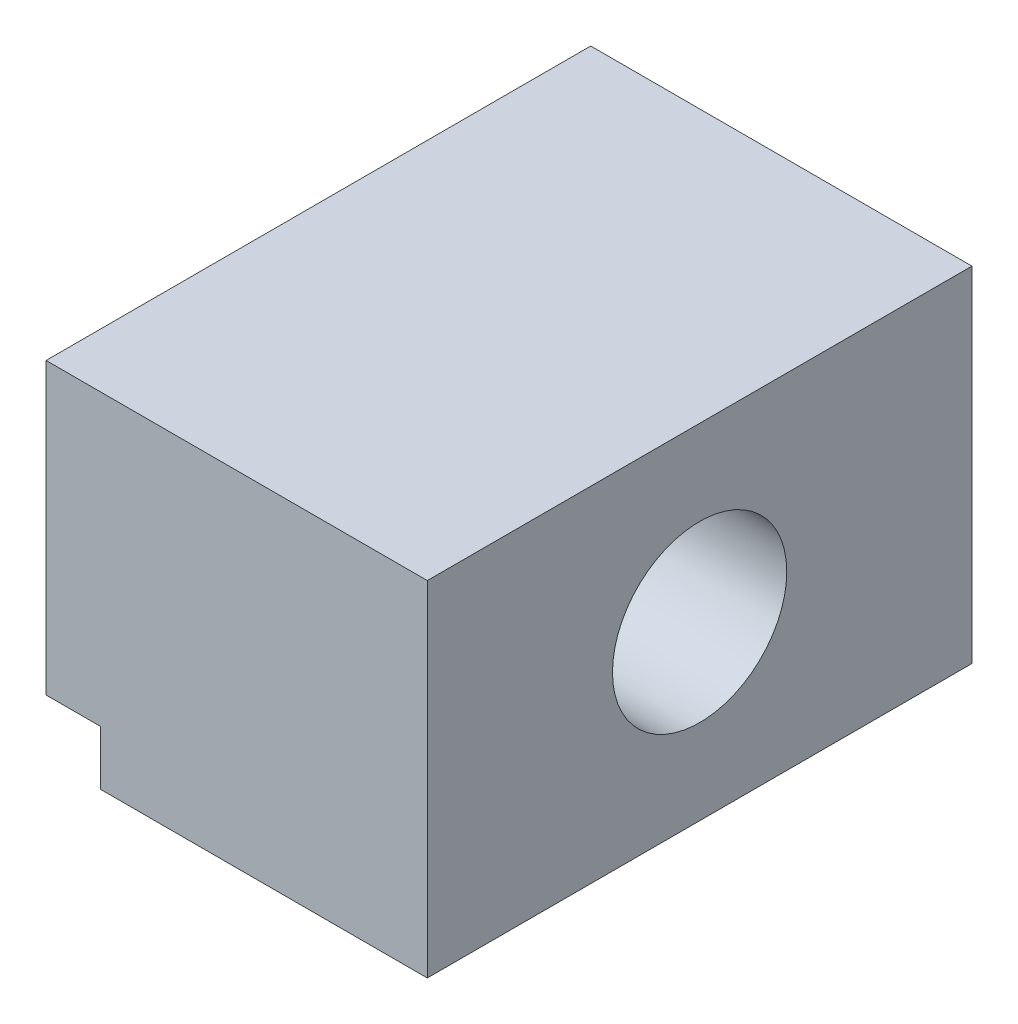
ISO-10303-21;
HEADER;
FILE_DESCRIPTION(('STEP AP214'),'2;1');
FILE_NAME('part.step','',(''),(''),'','','');
FILE_SCHEMA(('AUTOMOTIVE_DESIGN { 1 0 10303 214 1 1 1 1 }'));
ENDSEC;
DATA;
#1=APPLICATION_CONTEXT('core data for automotive mechanical design processes');
#2=APPLICATION_PROTOCOL_DEFINITION('international standard','automotive_design',2000,#1);
#3=PRODUCT_CONTEXT('',#1,'mechanical');
#4=PRODUCT('Part','Part','',(#3));
#5=PRODUCT_RELATED_PRODUCT_CATEGORY('part','',(#4));
#6=PRODUCT_DEFINITION_FORMATION('','',#4);
#7=PRODUCT_DEFINITION_CONTEXT('part definition',#1,'design');
#8=PRODUCT_DEFINITION('design','',#6,#7);
#9=PRODUCT_DEFINITION_SHAPE('','',#8);
#10=(LENGTH_UNIT() NAMED_UNIT(*) SI_UNIT(.MILLI.,.METRE.));
#11=(NAMED_UNIT(*) PLANE_ANGLE_UNIT() SI_UNIT($,.RADIAN.));
#12=(NAMED_UNIT(*) SI_UNIT($,.STERADIAN.) SOLID_ANGLE_UNIT());
#13=UNCERTAINTY_MEASURE_WITH_UNIT(LENGTH_MEASURE(1.E-05),#10,'distance_accuracy_value','');
#14=(GEOMETRIC_REPRESENTATION_CONTEXT(3) GLOBAL_UNCERTAINTY_ASSIGNED_CONTEXT((#13)) GLOBAL_UNIT_ASSIGNED_CONTEXT((#10,
#11,#12)) REPRESENTATION_CONTEXT('',''));
#15=CARTESIAN_POINT('',(0.,0.,0.));
#16=DIRECTION('',(0.,0.,1.));
#17=DIRECTION('',(1.,0.,0.));
#18=AXIS2_PLACEMENT_3D('',#15,#16,#17);
#19=CARTESIAN_POINT('',(-3.,0.5,-2.5));
#20=DIRECTION('',(0.,0.,1.));
#21=DIRECTION('',(1.,0.,0.));
#22=AXIS2_PLACEMENT_3D('',#19,#20,#21);
#23=PLANE('',#22);
#24=DIRECTION('',(-1.,0.,0.));
#25=VECTOR('',#24,1.);
#26=CARTESIAN_POINT('',(-3.5,3.16,-2.5));
#27=LINE('',#26,#25);
#28=CARTESIAN_POINT('',(0.,3.16,-2.5));
#29=VERTEX_POINT('',#28);
#30=CARTESIAN_POINT('',(-3.5,3.16,-2.5));
#31=VERTEX_POINT('',#30);
#32=EDGE_CURVE('E180',#29,#31,#27,.T.);
#33=ORIENTED_EDGE('',*,*,#32,.F.);
#34=DIRECTION('',(0.,1.,0.));
#35=VECTOR('',#34,1.);
#36=CARTESIAN_POINT('',(0.,0.,-2.5));
#37=LINE('',#36,#35);
#38=CARTESIAN_POINT('',(0.,0.,-2.5));
#39=VERTEX_POINT('',#38);
#40=EDGE_CURVE('E58',#39,#29,#37,.T.);
#41=ORIENTED_EDGE('',*,*,#40,.F.);
#42=DIRECTION('',(-1.,0.,0.));
#43=VECTOR('',#42,1.);
#44=CARTESIAN_POINT('',(-3.,0.,-2.5));
#45=LINE('',#44,#43);
#46=CARTESIAN_POINT('',(-3.,0.,-2.5));
#47=VERTEX_POINT('',#46);
#48=EDGE_CURVE('E116',#39,#47,#45,.T.);
#49=ORIENTED_EDGE('',*,*,#48,.T.);
#50=DIRECTION('',(0.,-1.,0.));
#51=VECTOR('',#50,1.);
#52=CARTESIAN_POINT('',(-3.,0.5,-2.5));
#53=LINE('',#52,#51);
#54=CARTESIAN_POINT('',(-3.,0.5,-2.5));
#55=VERTEX_POINT('',#54);
#56=EDGE_CURVE('E136',#55,#47,#53,.T.);
#57=ORIENTED_EDGE('',*,*,#56,.F.);
#58=DIRECTION('',(-1.,0.,0.));
#59=VECTOR('',#58,1.);
#60=CARTESIAN_POINT('',(-3.5,0.5,-2.5));
#61=LINE('',#60,#59);
#62=CARTESIAN_POINT('',(-3.5,0.5,-2.5));
#63=VERTEX_POINT('',#62);
#64=EDGE_CURVE('E199',#55,#63,#61,.T.);
#65=ORIENTED_EDGE('',*,*,#64,.T.);
#66=DIRECTION('',(0.,-1.,0.));
#67=VECTOR('',#66,1.);
#68=CARTESIAN_POINT('',(-3.5,14.9223252670426,-2.5));
#69=LINE('',#68,#67);
#70=EDGE_CURVE('E182',#31,#63,#69,.T.);
#71=ORIENTED_EDGE('',*,*,#70,.F.);
#72=EDGE_LOOP('',(#33,#41,#49,#57,#65,#71));
#73=FACE_BOUND('',#72,.T.);
#74=ADVANCED_FACE('F40',(#73),#23,.F.);
#75=CARTESIAN_POINT('',(-3.,0.5,-2.5));
#76=DIRECTION('',(1.,0.,0.));
#77=DIRECTION('',(0.,0.,-1.));
#78=AXIS2_PLACEMENT_3D('',#75,#76,#77);
#79=PLANE('',#78);
#80=DIRECTION('',(0.,0.,1.));
#81=VECTOR('',#80,1.);
#82=CARTESIAN_POINT('',(-3.,0.,-2.5));
#83=LINE('',#82,#81);
#84=CARTESIAN_POINT('',(-3.,0.,2.5));
#85=VERTEX_POINT('',#84);
#86=EDGE_CURVE('E125',#47,#85,#83,.T.);
#87=ORIENTED_EDGE('',*,*,#86,.T.);
#88=DIRECTION('',(0.,-1.,0.));
#89=VECTOR('',#88,1.);
#90=CARTESIAN_POINT('',(-3.,0.5,2.5));
#91=LINE('',#90,#89);
#92=CARTESIAN_POINT('',(-3.,0.5,2.5));
#93=VERTEX_POINT('',#92);
#94=EDGE_CURVE('E122',#93,#85,#91,.T.);
#95=ORIENTED_EDGE('',*,*,#94,.F.);
#96=DIRECTION('',(0.,0.,1.));
#97=VECTOR('',#96,1.);
#98=CARTESIAN_POINT('',(-3.,0.5,-2.5));
#99=LINE('',#98,#97);
#100=EDGE_CURVE('E124',#55,#93,#99,.T.);
#101=ORIENTED_EDGE('',*,*,#100,.F.);
#102=ORIENTED_EDGE('',*,*,#56,.T.);
#103=EDGE_LOOP('',(#87,#95,#101,#102));
#104=FACE_BOUND('',#103,.T.);
#105=ADVANCED_FACE('F170',(#104),#79,.F.);
#106=CARTESIAN_POINT('',(-3.,0.5,2.5));
#107=DIRECTION('',(0.,0.,-1.));
#108=DIRECTION('',(-1.,0.,0.));
#109=AXIS2_PLACEMENT_3D('',#106,#107,#108);
#110=PLANE('',#109);
#111=DIRECTION('',(1.,0.,0.));
#112=VECTOR('',#111,1.);
#113=CARTESIAN_POINT('',(-3.,0.,2.5));
#114=LINE('',#113,#112);
#115=CARTESIAN_POINT('',(0.,0.,2.5));
#116=VERTEX_POINT('',#115);
#117=EDGE_CURVE('E115',#85,#116,#114,.T.);
#118=ORIENTED_EDGE('',*,*,#117,.T.);
#119=DIRECTION('',(0.,1.,0.));
#120=VECTOR('',#119,1.);
#121=CARTESIAN_POINT('',(0.,0.,2.5));
#122=LINE('',#121,#120);
#123=CARTESIAN_POINT('',(0.,3.16,2.5));
#124=VERTEX_POINT('',#123);
#125=EDGE_CURVE('E98',#116,#124,#122,.T.);
#126=ORIENTED_EDGE('',*,*,#125,.T.);
#127=DIRECTION('',(1.,0.,0.));
#128=VECTOR('',#127,1.);
#129=CARTESIAN_POINT('',(-3.5,3.16,2.5));
#130=LINE('',#129,#128);
#131=CARTESIAN_POINT('',(-3.5,3.16,2.5));
#132=VERTEX_POINT('',#131);
#133=EDGE_CURVE('E187',#132,#124,#130,.T.);
#134=ORIENTED_EDGE('',*,*,#133,.F.);
#135=DIRECTION('',(0.,-1.,0.));
#136=VECTOR('',#135,1.);
#137=CARTESIAN_POINT('',(-3.5,14.9223252670426,2.5));
#138=LINE('',#137,#136);
#139=CARTESIAN_POINT('',(-3.5,0.5,2.5));
#140=VERTEX_POINT('',#139);
#141=EDGE_CURVE('E200',#132,#140,#138,.T.);
#142=ORIENTED_EDGE('',*,*,#141,.T.);
#143=DIRECTION('',(1.,0.,0.));
#144=VECTOR('',#143,1.);
#145=CARTESIAN_POINT('',(-3.5,0.5,2.5));
#146=LINE('',#145,#144);
#147=EDGE_CURVE('E192',#140,#93,#146,.T.);
#148=ORIENTED_EDGE('',*,*,#147,.T.);
#149=ORIENTED_EDGE('',*,*,#94,.T.);
#150=EDGE_LOOP('',(#118,#126,#134,#142,#148,#149));
#151=FACE_BOUND('',#150,.T.);
#152=ADVANCED_FACE('F120',(#151),#110,.F.);
#153=CARTESIAN_POINT('',(0.,0.,0.));
#154=DIRECTION('',(0.,1.,0.));
#155=DIRECTION('',(0.,0.,1.));
#156=AXIS2_PLACEMENT_3D('',#153,#154,#155);
#157=PLANE('',#156);
#158=ORIENTED_EDGE('',*,*,#48,.F.);
#159=DIRECTION('',(0.,0.,1.));
#160=VECTOR('',#159,1.);
#161=CARTESIAN_POINT('',(0.,0.,-2.5));
#162=LINE('',#161,#160);
#163=EDGE_CURVE('E102',#39,#116,#162,.T.);
#164=ORIENTED_EDGE('',*,*,#163,.T.);
#165=ORIENTED_EDGE('',*,*,#117,.F.);
#166=ORIENTED_EDGE('',*,*,#86,.F.);
#167=EDGE_LOOP('',(#158,#164,#165,#166));
#168=FACE_BOUND('',#167,.T.);
#169=ADVANCED_FACE('F113',(#168),#157,.F.);
#170=CARTESIAN_POINT('',(-3.5,14.9223252670426,2.5));
#171=DIRECTION('',(1.,0.,0.));
#172=DIRECTION('',(0.,0.,-1.));
#173=AXIS2_PLACEMENT_3D('',#170,#171,#172);
#174=PLANE('',#173);
#175=DIRECTION('',(0.,0.,1.));
#176=VECTOR('',#175,1.);
#177=CARTESIAN_POINT('',(-3.5,0.5,2.5));
#178=LINE('',#177,#176);
#179=CARTESIAN_POINT('',(-3.5,0.5,-0.723602100605025));
#180=VERTEX_POINT('',#179);
#181=EDGE_CURVE('E203',#63,#180,#178,.T.);
#182=ORIENTED_EDGE('',*,*,#181,.T.);
#183=CARTESIAN_POINT('',(-3.5,1.58,0.));
#184=DIRECTION('',(1.,0.,0.));
#185=DIRECTION('',(0.,0.,-1.));
#186=AXIS2_PLACEMENT_3D('',#183,#184,#185);
#187=CIRCLE('',#186,1.3);
#188=CARTESIAN_POINT('',(-3.5,0.5,0.723602100605025));
#189=VERTEX_POINT('',#188);
#190=EDGE_CURVE('E51',#180,#189,#187,.T.);
#191=ORIENTED_EDGE('',*,*,#190,.T.);
#192=EDGE_CURVE('E198',#189,#140,#178,.T.);
#193=ORIENTED_EDGE('',*,*,#192,.T.);
#194=ORIENTED_EDGE('',*,*,#141,.F.);
#195=DIRECTION('',(0.,0.,1.));
#196=VECTOR('',#195,1.);
#197=CARTESIAN_POINT('',(-3.5,3.16,2.5));
#198=LINE('',#197,#196);
#199=EDGE_CURVE('E186',#31,#132,#198,.T.);
#200=ORIENTED_EDGE('',*,*,#199,.F.);
#201=ORIENTED_EDGE('',*,*,#70,.T.);
#202=EDGE_LOOP('',(#182,#191,#193,#194,#200,#201));
#203=FACE_BOUND('',#202,.T.);
#204=ADVANCED_FACE('F156',(#203),#174,.F.);
#205=CARTESIAN_POINT('',(0.,0.5,0.));
#206=DIRECTION('',(0.,-1.,0.));
#207=DIRECTION('',(0.,0.,-1.));
#208=AXIS2_PLACEMENT_3D('',#205,#206,#207);
#209=PLANE('',#208);
#210=ORIENTED_EDGE('',*,*,#192,.F.);
#211=CARTESIAN_POINT('',(-3.5,0.5,0.723602100605025));
#212=CARTESIAN_POINT('',(-3.47856687928063,0.5,0.685039533998082));
#213=CARTESIAN_POINT('',(-3.45799700577048,0.5,0.646006901532782));
#214=CARTESIAN_POINT('',(-3.41912062776124,0.5,0.566639783998304));
#215=CARTESIAN_POINT('',(-3.40082369728594,0.5,0.526300638310948));
#216=CARTESIAN_POINT('',(-3.35013879452994,0.5,0.40259107297455));
#217=CARTESIAN_POINT('',(-3.32232563261118,0.5,0.317148275129609));
#218=CARTESIAN_POINT('',(-3.29094418799593,0.5,0.166107175464404));
#219=CARTESIAN_POINT('',(-3.28281885997334,0.5,0.101492334869599));
#220=CARTESIAN_POINT('',(-3.27843948171255,0.5,-0.0277503592845022));
#221=CARTESIAN_POINT('',(-3.28210862193313,0.5,-0.0923753990414826));
#222=CARTESIAN_POINT('',(-3.30256679090434,0.5,-0.23541487413347));
#223=CARTESIAN_POINT('',(-3.322314238145,0.5,-0.313384284795318));
#224=CARTESIAN_POINT('',(-3.37382637152783,0.5,-0.465501301179842));
#225=CARTESIAN_POINT('',(-3.40566478504021,0.5,-0.539622222873336));
#226=CARTESIAN_POINT('',(-3.45058211214991,0.5,-0.630730789972909));
#227=CARTESIAN_POINT('',(-3.46017805233087,0.5,-0.649537557182328));
#228=CARTESIAN_POINT('',(-3.47978184370034,0.5,-0.686799323366572));
#229=CARTESIAN_POINT('',(-3.48978704945006,0.5,-0.705255712623798));
#230=CARTESIAN_POINT('',(-3.49999999999999,0.5,-0.723602100605029));
#231=B_SPLINE_CURVE_WITH_KNOTS('',3,(#211,#212,#213,#214,#215,#216,#217,#218,#219,#220,#221,
#222,#223,#224,#225,#226,#227,#228,#229,#230),.UNSPECIFIED.,.F.,.F.,(4,2,2,2,2,2,2,2,2,4),(0.,
0.132308459650685,0.265156578029529,0.533002504889509,0.72739763658082,0.920529372892125,
1.16036979287796,1.40169680746694,1.46503665623533,1.52801719723665),.UNSPECIFIED.);
#232=EDGE_CURVE('E12',#189,#180,#231,.T.);
#233=ORIENTED_EDGE('',*,*,#232,.T.);
#234=ORIENTED_EDGE('',*,*,#181,.F.);
#235=ORIENTED_EDGE('',*,*,#64,.F.);
#236=ORIENTED_EDGE('',*,*,#100,.T.);
#237=ORIENTED_EDGE('',*,*,#147,.F.);
#238=EDGE_LOOP('',(#210,#233,#234,#235,#236,#237));
#239=FACE_BOUND('',#238,.T.);
#240=ADVANCED_FACE('F150',(#239),#209,.T.);
#241=CARTESIAN_POINT('',(0.,3.16,0.));
#242=DIRECTION('',(0.,1.,0.));
#243=DIRECTION('',(0.,0.,1.));
#244=AXIS2_PLACEMENT_3D('',#241,#242,#243);
#245=PLANE('',#244);
#246=DIRECTION('',(0.,0.,1.));
#247=VECTOR('',#246,1.);
#248=CARTESIAN_POINT('',(0.,3.16,0.));
#249=LINE('',#248,#247);
#250=EDGE_CURVE('E103',#29,#124,#249,.T.);
#251=ORIENTED_EDGE('',*,*,#250,.F.);
#252=ORIENTED_EDGE('',*,*,#32,.T.);
#253=ORIENTED_EDGE('',*,*,#199,.T.);
#254=ORIENTED_EDGE('',*,*,#133,.T.);
#255=EDGE_LOOP('',(#251,#252,#253,#254));
#256=FACE_BOUND('',#255,.T.);
#257=ADVANCED_FACE('F155',(#256),#245,.T.);
#258=CARTESIAN_POINT('',(3.5,1.58,0.));
#259=DIRECTION('',(-1.,0.,0.));
#260=DIRECTION('',(0.,0.,1.));
#261=AXIS2_PLACEMENT_3D('',#258,#259,#260);
#262=CYLINDRICAL_SURFACE('',#261,0.8);
#263=CARTESIAN_POINT('',(0.,1.58,0.));
#264=DIRECTION('',(-1.,0.,0.));
#265=DIRECTION('',(0.,0.,1.));
#266=AXIS2_PLACEMENT_3D('',#263,#264,#265);
#267=CIRCLE('',#266,0.8);
#268=CARTESIAN_POINT('',(0.,1.58,0.8));
#269=VERTEX_POINT('',#268);
#270=EDGE_CURVE('E45',#269,#269,#267,.F.);
#271=ORIENTED_EDGE('',*,*,#270,.T.);
#272=EDGE_LOOP('',(#271));
#273=FACE_BOUND('',#272,.T.);
#274=CARTESIAN_POINT('',(-3.,1.58,0.));
#275=DIRECTION('',(1.,0.,0.));
#276=DIRECTION('',(0.,0.,-1.));
#277=AXIS2_PLACEMENT_3D('',#274,#275,#276);
#278=CIRCLE('',#277,0.8);
#279=CARTESIAN_POINT('',(-3.,1.58,-0.8));
#280=VERTEX_POINT('',#279);
#281=EDGE_CURVE('E140',#280,#280,#278,.F.);
#282=ORIENTED_EDGE('',*,*,#281,.T.);
#283=EDGE_LOOP('',(#282));
#284=FACE_BOUND('',#283,.T.);
#285=ADVANCED_FACE('F158',(#273,#284),#262,.F.);
#286=CARTESIAN_POINT('',(-3.,1.58,0.));
#287=DIRECTION('',(-1.,0.,0.));
#288=DIRECTION('',(0.,0.,1.));
#289=AXIS2_PLACEMENT_3D('',#286,#287,#288);
#290=CONICAL_SURFACE('',#289,0.8,0.78539816339745);
#291=ORIENTED_EDGE('',*,*,#232,.F.);
#292=ORIENTED_EDGE('',*,*,#190,.F.);
#293=EDGE_LOOP('',(#291,#292));
#294=FACE_BOUND('',#293,.T.);
#295=ORIENTED_EDGE('',*,*,#281,.F.);
#296=EDGE_LOOP('',(#295));
#297=FACE_BOUND('',#296,.T.);
#298=ADVANCED_FACE('F42',(#294,#297),#290,.F.);
#299=CARTESIAN_POINT('',(0.,0.,-2.5));
#300=DIRECTION('',(-1.,0.,0.));
#301=DIRECTION('',(0.,0.,1.));
#302=AXIS2_PLACEMENT_3D('',#299,#300,#301);
#303=PLANE('',#302);
#304=ORIENTED_EDGE('',*,*,#250,.T.);
#305=ORIENTED_EDGE('',*,*,#125,.F.);
#306=ORIENTED_EDGE('',*,*,#163,.F.);
#307=ORIENTED_EDGE('',*,*,#40,.T.);
#308=EDGE_LOOP('',(#304,#305,#306,#307));
#309=FACE_BOUND('',#308,.T.);
#310=ORIENTED_EDGE('',*,*,#270,.F.);
#311=EDGE_LOOP('',(#310));
#312=FACE_BOUND('',#311,.T.);
#313=ADVANCED_FACE('F100',(#309,#312),#303,.F.);
#314=CLOSED_SHELL('',(#74,#105,#152,#169,#204,#240,#257,#285,#298,#313));
#315=MANIFOLD_SOLID_BREP('B2',#314);
#316=ADVANCED_BREP_SHAPE_REPRESENTATION('',(#18,#315),#14);
#317=SHAPE_DEFINITION_REPRESENTATION(#9,#316);
ENDSEC;
END-ISO-10303-21;
